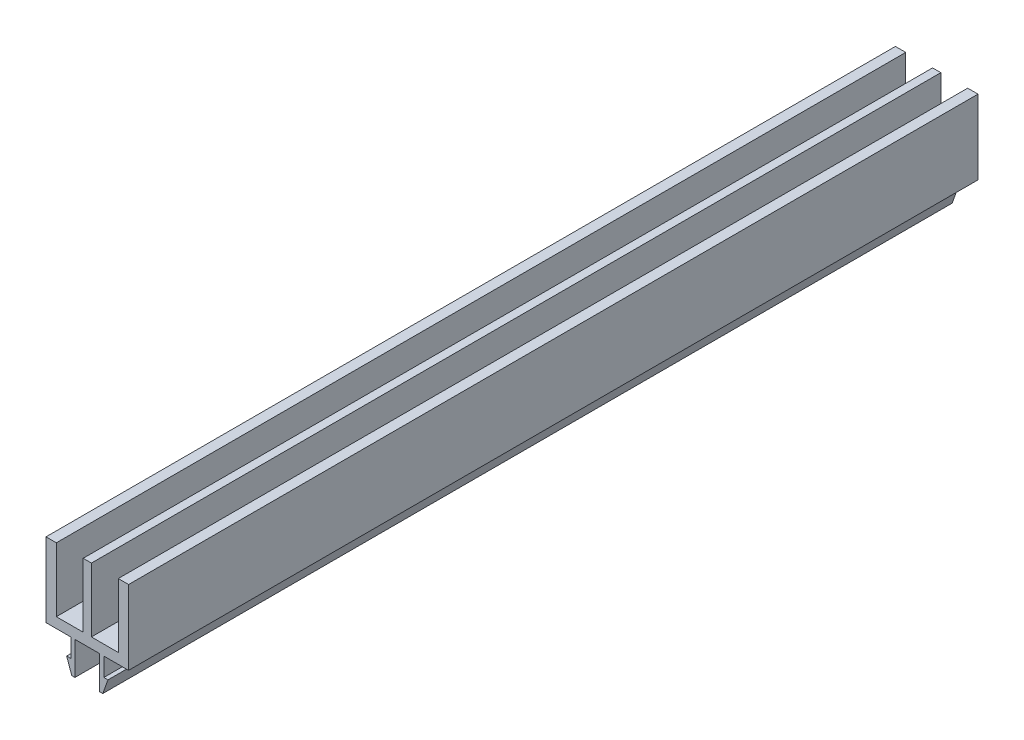
ISO-10303-21;
HEADER;
FILE_DESCRIPTION(('STEP AP214'),'2;1');
FILE_NAME('part.step','',(''),(''),'','','');
FILE_SCHEMA(('AUTOMOTIVE_DESIGN { 1 0 10303 214 1 1 1 1 }'));
ENDSEC;
DATA;
#1=APPLICATION_CONTEXT('core data for automotive mechanical design processes');
#2=APPLICATION_PROTOCOL_DEFINITION('international standard','automotive_design',2000,#1);
#3=PRODUCT_CONTEXT('',#1,'mechanical');
#4=PRODUCT('Part','Part','',(#3));
#5=PRODUCT_RELATED_PRODUCT_CATEGORY('part','',(#4));
#6=PRODUCT_DEFINITION_FORMATION('','',#4);
#7=PRODUCT_DEFINITION_CONTEXT('part definition',#1,'design');
#8=PRODUCT_DEFINITION('design','',#6,#7);
#9=PRODUCT_DEFINITION_SHAPE('','',#8);
#10=(LENGTH_UNIT() NAMED_UNIT(*) SI_UNIT(.MILLI.,.METRE.));
#11=(NAMED_UNIT(*) PLANE_ANGLE_UNIT() SI_UNIT($,.RADIAN.));
#12=(NAMED_UNIT(*) SI_UNIT($,.STERADIAN.) SOLID_ANGLE_UNIT());
#13=UNCERTAINTY_MEASURE_WITH_UNIT(LENGTH_MEASURE(1.E-05),#10,'distance_accuracy_value','');
#14=(GEOMETRIC_REPRESENTATION_CONTEXT(3) GLOBAL_UNCERTAINTY_ASSIGNED_CONTEXT((#13)) GLOBAL_UNIT_ASSIGNED_CONTEXT((#10,
#11,#12)) REPRESENTATION_CONTEXT('',''));
#15=CARTESIAN_POINT('',(0.,0.,0.));
#16=DIRECTION('',(0.,0.,1.));
#17=DIRECTION('',(1.,0.,0.));
#18=AXIS2_PLACEMENT_3D('',#15,#16,#17);
#19=CARTESIAN_POINT('',(-1.,17.9999999975,-155.71));
#20=DIRECTION('',(-1.,0.,0.));
#21=DIRECTION('',(0.,-1.,0.));
#22=AXIS2_PLACEMENT_3D('',#19,#20,#21);
#23=PLANE('',#22);
#24=DIRECTION('',(0.,-1.,0.));
#25=VECTOR('',#24,1.);
#26=CARTESIAN_POINT('',(-1.,17.9999999975,50.));
#27=LINE('',#26,#25);
#28=CARTESIAN_POINT('',(-1.,17.9999999975,50.));
#29=VERTEX_POINT('',#28);
#30=CARTESIAN_POINT('',(-1.,2.4999999995,50.));
#31=VERTEX_POINT('',#30);
#32=EDGE_CURVE('E225',#29,#31,#27,.T.);
#33=ORIENTED_EDGE('',*,*,#32,.F.);
#34=DIRECTION('',(0.,0.,1.));
#35=VECTOR('',#34,1.);
#36=CARTESIAN_POINT('',(-1.,17.9999999975,-155.71));
#37=LINE('',#36,#35);
#38=CARTESIAN_POINT('',(-1.,17.9999999975,-155.71));
#39=VERTEX_POINT('',#38);
#40=EDGE_CURVE('E11',#39,#29,#37,.T.);
#41=ORIENTED_EDGE('',*,*,#40,.F.);
#42=DIRECTION('',(0.,-1.,0.));
#43=VECTOR('',#42,1.);
#44=CARTESIAN_POINT('',(-1.,17.9999999975,-155.71));
#45=LINE('',#44,#43);
#46=CARTESIAN_POINT('',(-1.,2.4999999995,-155.71));
#47=VERTEX_POINT('',#46);
#48=EDGE_CURVE('E293',#39,#47,#45,.T.);
#49=ORIENTED_EDGE('',*,*,#48,.T.);
#50=DIRECTION('',(0.,0.,1.));
#51=VECTOR('',#50,1.);
#52=CARTESIAN_POINT('',(-1.,2.4999999995,-155.71));
#53=LINE('',#52,#51);
#54=EDGE_CURVE('E35',#47,#31,#53,.T.);
#55=ORIENTED_EDGE('',*,*,#54,.T.);
#56=EDGE_LOOP('',(#33,#41,#49,#55));
#57=FACE_BOUND('',#56,.T.);
#58=ADVANCED_FACE('F32',(#57),#23,.T.);
#59=CARTESIAN_POINT('',(0.999999999999998,17.9999999975,-155.71));
#60=DIRECTION('',(0.,1.,0.));
#61=DIRECTION('',(0.,0.,1.));
#62=AXIS2_PLACEMENT_3D('',#59,#60,#61);
#63=PLANE('',#62);
#64=DIRECTION('',(-1.,0.,0.));
#65=VECTOR('',#64,1.);
#66=CARTESIAN_POINT('',(0.999999999999998,17.9999999975,50.));
#67=LINE('',#66,#65);
#68=CARTESIAN_POINT('',(0.999999999999998,17.9999999975,50.));
#69=VERTEX_POINT('',#68);
#70=EDGE_CURVE('E291',#69,#29,#67,.T.);
#71=ORIENTED_EDGE('',*,*,#70,.F.);
#72=DIRECTION('',(0.,0.,1.));
#73=VECTOR('',#72,1.);
#74=CARTESIAN_POINT('',(0.999999999999998,17.9999999975,-155.71));
#75=LINE('',#74,#73);
#76=CARTESIAN_POINT('',(0.999999999999998,17.9999999975,-155.71));
#77=VERTEX_POINT('',#76);
#78=EDGE_CURVE('E41',#77,#69,#75,.T.);
#79=ORIENTED_EDGE('',*,*,#78,.F.);
#80=DIRECTION('',(-1.,0.,0.));
#81=VECTOR('',#80,1.);
#82=CARTESIAN_POINT('',(0.999999999999998,17.9999999975,-155.71));
#83=LINE('',#82,#81);
#84=EDGE_CURVE('E215',#77,#39,#83,.T.);
#85=ORIENTED_EDGE('',*,*,#84,.T.);
#86=ORIENTED_EDGE('',*,*,#40,.T.);
#87=EDGE_LOOP('',(#71,#79,#85,#86));
#88=FACE_BOUND('',#87,.T.);
#89=ADVANCED_FACE('F337',(#88),#63,.T.);
#90=CARTESIAN_POINT('',(0.999999999999998,2.4999999995,-155.71));
#91=DIRECTION('',(1.,0.,0.));
#92=DIRECTION('',(0.,0.,-1.));
#93=AXIS2_PLACEMENT_3D('',#90,#91,#92);
#94=PLANE('',#93);
#95=DIRECTION('',(0.,1.,0.));
#96=VECTOR('',#95,1.);
#97=CARTESIAN_POINT('',(0.999999999999998,2.4999999995,50.));
#98=LINE('',#97,#96);
#99=CARTESIAN_POINT('',(0.999999999999998,2.4999999995,50.));
#100=VERTEX_POINT('',#99);
#101=EDGE_CURVE('E202',#100,#69,#98,.T.);
#102=ORIENTED_EDGE('',*,*,#101,.F.);
#103=DIRECTION('',(0.,0.,1.));
#104=VECTOR('',#103,1.);
#105=CARTESIAN_POINT('',(0.999999999999998,2.4999999995,-155.71));
#106=LINE('',#105,#104);
#107=CARTESIAN_POINT('',(0.999999999999998,2.4999999995,-155.71));
#108=VERTEX_POINT('',#107);
#109=EDGE_CURVE('E197',#108,#100,#106,.T.);
#110=ORIENTED_EDGE('',*,*,#109,.F.);
#111=DIRECTION('',(0.,1.,0.));
#112=VECTOR('',#111,1.);
#113=CARTESIAN_POINT('',(0.999999999999998,2.4999999995,-155.71));
#114=LINE('',#113,#112);
#115=EDGE_CURVE('E200',#108,#77,#114,.T.);
#116=ORIENTED_EDGE('',*,*,#115,.T.);
#117=ORIENTED_EDGE('',*,*,#78,.T.);
#118=EDGE_LOOP('',(#102,#110,#116,#117));
#119=FACE_BOUND('',#118,.T.);
#120=ADVANCED_FACE('F199',(#119),#94,.T.);
#121=CARTESIAN_POINT('',(7.5,2.4999999995,-155.71));
#122=DIRECTION('',(0.,1.,0.));
#123=DIRECTION('',(-1.,0.,0.));
#124=AXIS2_PLACEMENT_3D('',#121,#122,#123);
#125=PLANE('',#124);
#126=DIRECTION('',(-1.,0.,0.));
#127=VECTOR('',#126,1.);
#128=CARTESIAN_POINT('',(7.5,2.4999999995,50.));
#129=LINE('',#128,#127);
#130=CARTESIAN_POINT('',(7.5,2.4999999995,50.));
#131=VERTEX_POINT('',#130);
#132=EDGE_CURVE('E288',#131,#100,#129,.T.);
#133=ORIENTED_EDGE('',*,*,#132,.F.);
#134=DIRECTION('',(0.,0.,1.));
#135=VECTOR('',#134,1.);
#136=CARTESIAN_POINT('',(7.5,2.4999999995,-155.71));
#137=LINE('',#136,#135);
#138=CARTESIAN_POINT('',(7.5,2.4999999995,-155.71));
#139=VERTEX_POINT('',#138);
#140=EDGE_CURVE('E207',#139,#131,#137,.T.);
#141=ORIENTED_EDGE('',*,*,#140,.F.);
#142=DIRECTION('',(-1.,0.,0.));
#143=VECTOR('',#142,1.);
#144=CARTESIAN_POINT('',(7.5,2.4999999995,-155.71));
#145=LINE('',#144,#143);
#146=EDGE_CURVE('E213',#139,#108,#145,.T.);
#147=ORIENTED_EDGE('',*,*,#146,.T.);
#148=ORIENTED_EDGE('',*,*,#109,.T.);
#149=EDGE_LOOP('',(#133,#141,#147,#148));
#150=FACE_BOUND('',#149,.T.);
#151=ADVANCED_FACE('F217',(#150),#125,.T.);
#152=CARTESIAN_POINT('',(7.5,17.9999999975,-155.71));
#153=DIRECTION('',(-1.,0.,0.));
#154=DIRECTION('',(0.,-1.,0.));
#155=AXIS2_PLACEMENT_3D('',#152,#153,#154);
#156=PLANE('',#155);
#157=DIRECTION('',(0.,-1.,0.));
#158=VECTOR('',#157,1.);
#159=CARTESIAN_POINT('',(7.5,17.9999999975,50.));
#160=LINE('',#159,#158);
#161=CARTESIAN_POINT('',(7.5,17.9999999975,50.));
#162=VERTEX_POINT('',#161);
#163=EDGE_CURVE('E285',#162,#131,#160,.T.);
#164=ORIENTED_EDGE('',*,*,#163,.F.);
#165=DIRECTION('',(0.,0.,1.));
#166=VECTOR('',#165,1.);
#167=CARTESIAN_POINT('',(7.5,17.9999999975,-155.71));
#168=LINE('',#167,#166);
#169=CARTESIAN_POINT('',(7.5,17.9999999975,-155.71));
#170=VERTEX_POINT('',#169);
#171=EDGE_CURVE('E297',#170,#162,#168,.T.);
#172=ORIENTED_EDGE('',*,*,#171,.F.);
#173=DIRECTION('',(0.,-1.,0.));
#174=VECTOR('',#173,1.);
#175=CARTESIAN_POINT('',(7.5,17.9999999975,-155.71));
#176=LINE('',#175,#174);
#177=EDGE_CURVE('E218',#170,#139,#176,.T.);
#178=ORIENTED_EDGE('',*,*,#177,.T.);
#179=ORIENTED_EDGE('',*,*,#140,.T.);
#180=EDGE_LOOP('',(#164,#172,#178,#179));
#181=FACE_BOUND('',#180,.T.);
#182=ADVANCED_FACE('F350',(#181),#156,.T.);
#183=CARTESIAN_POINT('',(10.,17.9999999975,-155.71));
#184=DIRECTION('',(0.,1.,0.));
#185=DIRECTION('',(0.,0.,1.));
#186=AXIS2_PLACEMENT_3D('',#183,#184,#185);
#187=PLANE('',#186);
#188=DIRECTION('',(-1.,0.,0.));
#189=VECTOR('',#188,1.);
#190=CARTESIAN_POINT('',(10.,17.9999999975,50.));
#191=LINE('',#190,#189);
#192=CARTESIAN_POINT('',(10.,17.9999999975,50.));
#193=VERTEX_POINT('',#192);
#194=EDGE_CURVE('E282',#193,#162,#191,.T.);
#195=ORIENTED_EDGE('',*,*,#194,.F.);
#196=DIRECTION('',(0.,0.,1.));
#197=VECTOR('',#196,1.);
#198=CARTESIAN_POINT('',(10.,17.9999999975,-155.71));
#199=LINE('',#198,#197);
#200=CARTESIAN_POINT('',(10.,17.9999999975,-155.71));
#201=VERTEX_POINT('',#200);
#202=EDGE_CURVE('E299',#201,#193,#199,.T.);
#203=ORIENTED_EDGE('',*,*,#202,.F.);
#204=DIRECTION('',(-1.,0.,0.));
#205=VECTOR('',#204,1.);
#206=CARTESIAN_POINT('',(10.,17.9999999975,-155.71));
#207=LINE('',#206,#205);
#208=EDGE_CURVE('E220',#201,#170,#207,.T.);
#209=ORIENTED_EDGE('',*,*,#208,.T.);
#210=ORIENTED_EDGE('',*,*,#171,.T.);
#211=EDGE_LOOP('',(#195,#203,#209,#210));
#212=FACE_BOUND('',#211,.T.);
#213=ADVANCED_FACE('F353',(#212),#187,.T.);
#214=CARTESIAN_POINT('',(10.,-4.99999828349541E-10,-155.71));
#215=DIRECTION('',(1.,0.,0.));
#216=DIRECTION('',(0.,0.,-1.));
#217=AXIS2_PLACEMENT_3D('',#214,#215,#216);
#218=PLANE('',#217);
#219=DIRECTION('',(0.,1.,0.));
#220=VECTOR('',#219,1.);
#221=CARTESIAN_POINT('',(10.,-4.99999828349541E-10,50.));
#222=LINE('',#221,#220);
#223=CARTESIAN_POINT('',(10.,-4.99999828349541E-10,50.));
#224=VERTEX_POINT('',#223);
#225=EDGE_CURVE('E279',#224,#193,#222,.T.);
#226=ORIENTED_EDGE('',*,*,#225,.F.);
#227=DIRECTION('',(0.,0.,1.));
#228=VECTOR('',#227,1.);
#229=CARTESIAN_POINT('',(10.,-4.99999828349541E-10,-155.71));
#230=LINE('',#229,#228);
#231=CARTESIAN_POINT('',(10.,-4.99999828349541E-10,-155.71));
#232=VERTEX_POINT('',#231);
#233=EDGE_CURVE('E301',#232,#224,#230,.T.);
#234=ORIENTED_EDGE('',*,*,#233,.F.);
#235=DIRECTION('',(0.,1.,0.));
#236=VECTOR('',#235,1.);
#237=CARTESIAN_POINT('',(10.,-4.99999828349541E-10,-155.71));
#238=LINE('',#237,#236);
#239=EDGE_CURVE('E643',#232,#201,#238,.T.);
#240=ORIENTED_EDGE('',*,*,#239,.T.);
#241=ORIENTED_EDGE('',*,*,#202,.T.);
#242=EDGE_LOOP('',(#226,#234,#240,#241));
#243=FACE_BOUND('',#242,.T.);
#244=ADVANCED_FACE('F357',(#243),#218,.T.);
#245=CARTESIAN_POINT('',(4.,-4.99999998002099E-10,-155.71));
#246=DIRECTION('',(0.,-1.,0.));
#247=DIRECTION('',(1.,0.,0.));
#248=AXIS2_PLACEMENT_3D('',#245,#246,#247);
#249=PLANE('',#248);
#250=DIRECTION('',(1.,0.,0.));
#251=VECTOR('',#250,1.);
#252=CARTESIAN_POINT('',(4.,-4.99999998002099E-10,50.));
#253=LINE('',#252,#251);
#254=CARTESIAN_POINT('',(4.,-4.99999998002099E-10,50.));
#255=VERTEX_POINT('',#254);
#256=EDGE_CURVE('E276',#255,#224,#253,.T.);
#257=ORIENTED_EDGE('',*,*,#256,.F.);
#258=DIRECTION('',(0.,0.,1.));
#259=VECTOR('',#258,1.);
#260=CARTESIAN_POINT('',(4.,-4.99999998002099E-10,-155.71));
#261=LINE('',#260,#259);
#262=CARTESIAN_POINT('',(4.,-4.99999998002099E-10,-155.71));
#263=VERTEX_POINT('',#262);
#264=EDGE_CURVE('E303',#263,#255,#261,.T.);
#265=ORIENTED_EDGE('',*,*,#264,.F.);
#266=DIRECTION('',(1.,0.,0.));
#267=VECTOR('',#266,1.);
#268=CARTESIAN_POINT('',(4.,-4.99999998002099E-10,-155.71));
#269=LINE('',#268,#267);
#270=EDGE_CURVE('E647',#263,#232,#269,.T.);
#271=ORIENTED_EDGE('',*,*,#270,.T.);
#272=ORIENTED_EDGE('',*,*,#233,.T.);
#273=EDGE_LOOP('',(#257,#265,#271,#272));
#274=FACE_BOUND('',#273,.T.);
#275=ADVANCED_FACE('F361',(#274),#249,.T.);
#276=CARTESIAN_POINT('',(4.,-4.5,-155.71));
#277=DIRECTION('',(1.,0.,0.));
#278=DIRECTION('',(0.,0.,-1.));
#279=AXIS2_PLACEMENT_3D('',#276,#277,#278);
#280=PLANE('',#279);
#281=DIRECTION('',(0.,1.,0.));
#282=VECTOR('',#281,1.);
#283=CARTESIAN_POINT('',(4.,-4.5,50.));
#284=LINE('',#283,#282);
#285=CARTESIAN_POINT('',(4.,-4.5,50.));
#286=VERTEX_POINT('',#285);
#287=EDGE_CURVE('E273',#286,#255,#284,.T.);
#288=ORIENTED_EDGE('',*,*,#287,.F.);
#289=DIRECTION('',(0.,0.,1.));
#290=VECTOR('',#289,1.);
#291=CARTESIAN_POINT('',(4.,-4.5,-155.71));
#292=LINE('',#291,#290);
#293=CARTESIAN_POINT('',(4.,-4.5,-155.71));
#294=VERTEX_POINT('',#293);
#295=EDGE_CURVE('E305',#294,#286,#292,.T.);
#296=ORIENTED_EDGE('',*,*,#295,.F.);
#297=DIRECTION('',(0.,1.,0.));
#298=VECTOR('',#297,1.);
#299=CARTESIAN_POINT('',(4.,-4.5,-155.71));
#300=LINE('',#299,#298);
#301=EDGE_CURVE('E636',#294,#263,#300,.T.);
#302=ORIENTED_EDGE('',*,*,#301,.T.);
#303=ORIENTED_EDGE('',*,*,#264,.T.);
#304=EDGE_LOOP('',(#288,#296,#302,#303));
#305=FACE_BOUND('',#304,.T.);
#306=ADVANCED_FACE('F365',(#305),#280,.T.);
#307=CARTESIAN_POINT('',(5.,-4.5,-155.71));
#308=DIRECTION('',(0.,1.,0.));
#309=DIRECTION('',(0.,0.,1.));
#310=AXIS2_PLACEMENT_3D('',#307,#308,#309);
#311=PLANE('',#310);
#312=DIRECTION('',(-1.,0.,0.));
#313=VECTOR('',#312,1.);
#314=CARTESIAN_POINT('',(5.,-4.5,50.));
#315=LINE('',#314,#313);
#316=CARTESIAN_POINT('',(5.,-4.5,50.));
#317=VERTEX_POINT('',#316);
#318=EDGE_CURVE('E270',#317,#286,#315,.T.);
#319=ORIENTED_EDGE('',*,*,#318,.F.);
#320=DIRECTION('',(0.,0.,1.));
#321=VECTOR('',#320,1.);
#322=CARTESIAN_POINT('',(5.,-4.5,-155.71));
#323=LINE('',#322,#321);
#324=CARTESIAN_POINT('',(5.,-4.5,-155.71));
#325=VERTEX_POINT('',#324);
#326=EDGE_CURVE('E307',#325,#317,#323,.T.);
#327=ORIENTED_EDGE('',*,*,#326,.F.);
#328=DIRECTION('',(-1.,0.,0.));
#329=VECTOR('',#328,1.);
#330=CARTESIAN_POINT('',(5.,-4.5,-155.71));
#331=LINE('',#330,#329);
#332=EDGE_CURVE('E632',#325,#294,#331,.T.);
#333=ORIENTED_EDGE('',*,*,#332,.T.);
#334=ORIENTED_EDGE('',*,*,#295,.T.);
#335=EDGE_LOOP('',(#319,#327,#333,#334));
#336=FACE_BOUND('',#335,.T.);
#337=ADVANCED_FACE('F369',(#336),#311,.T.);
#338=CARTESIAN_POINT('',(3.75,-8.,-155.71));
#339=DIRECTION('',(0.941741911594837,-0.336336396998157,0.));
#340=DIRECTION('',(0.336336396998157,0.941741911594837,0.));
#341=AXIS2_PLACEMENT_3D('',#338,#339,#340);
#342=PLANE('',#341);
#343=DIRECTION('',(0.336336396998157,0.941741911594837,0.));
#344=VECTOR('',#343,1.);
#345=CARTESIAN_POINT('',(3.75,-8.,50.));
#346=LINE('',#345,#344);
#347=CARTESIAN_POINT('',(3.75,-8.,50.));
#348=VERTEX_POINT('',#347);
#349=EDGE_CURVE('E267',#348,#317,#346,.T.);
#350=ORIENTED_EDGE('',*,*,#349,.F.);
#351=DIRECTION('',(0.,0.,1.));
#352=VECTOR('',#351,1.);
#353=CARTESIAN_POINT('',(3.75,-8.,-155.71));
#354=LINE('',#353,#352);
#355=CARTESIAN_POINT('',(3.75,-8.,-155.71));
#356=VERTEX_POINT('',#355);
#357=EDGE_CURVE('E309',#356,#348,#354,.T.);
#358=ORIENTED_EDGE('',*,*,#357,.F.);
#359=DIRECTION('',(0.336336396998157,0.941741911594837,0.));
#360=VECTOR('',#359,1.);
#361=CARTESIAN_POINT('',(3.75,-8.,-155.71));
#362=LINE('',#361,#360);
#363=EDGE_CURVE('E653',#356,#325,#362,.T.);
#364=ORIENTED_EDGE('',*,*,#363,.T.);
#365=ORIENTED_EDGE('',*,*,#326,.T.);
#366=EDGE_LOOP('',(#350,#358,#364,#365));
#367=FACE_BOUND('',#366,.T.);
#368=ADVANCED_FACE('F373',(#367),#342,.T.);
#369=CARTESIAN_POINT('',(3.,-8.,-155.71));
#370=DIRECTION('',(0.,-1.,0.));
#371=DIRECTION('',(0.,0.,-1.));
#372=AXIS2_PLACEMENT_3D('',#369,#370,#371);
#373=PLANE('',#372);
#374=DIRECTION('',(1.,0.,0.));
#375=VECTOR('',#374,1.);
#376=CARTESIAN_POINT('',(3.,-8.,50.));
#377=LINE('',#376,#375);
#378=CARTESIAN_POINT('',(3.,-8.,50.));
#379=VERTEX_POINT('',#378);
#380=EDGE_CURVE('E264',#379,#348,#377,.T.);
#381=ORIENTED_EDGE('',*,*,#380,.F.);
#382=DIRECTION('',(0.,0.,1.));
#383=VECTOR('',#382,1.);
#384=CARTESIAN_POINT('',(3.,-8.,-155.71));
#385=LINE('',#384,#383);
#386=CARTESIAN_POINT('',(3.,-8.,-155.71));
#387=VERTEX_POINT('',#386);
#388=EDGE_CURVE('E311',#387,#379,#385,.T.);
#389=ORIENTED_EDGE('',*,*,#388,.F.);
#390=DIRECTION('',(1.,0.,0.));
#391=VECTOR('',#390,1.);
#392=CARTESIAN_POINT('',(3.,-8.,-155.71));
#393=LINE('',#392,#391);
#394=EDGE_CURVE('E625',#387,#356,#393,.T.);
#395=ORIENTED_EDGE('',*,*,#394,.T.);
#396=ORIENTED_EDGE('',*,*,#357,.T.);
#397=EDGE_LOOP('',(#381,#389,#395,#396));
#398=FACE_BOUND('',#397,.T.);
#399=ADVANCED_FACE('F377',(#398),#373,.T.);
#400=CARTESIAN_POINT('',(3.,-4.9999985194348E-10,-155.71));
#401=DIRECTION('',(-1.,0.,0.));
#402=DIRECTION('',(0.,0.,1.));
#403=AXIS2_PLACEMENT_3D('',#400,#401,#402);
#404=PLANE('',#403);
#405=DIRECTION('',(0.,-1.,0.));
#406=VECTOR('',#405,1.);
#407=CARTESIAN_POINT('',(3.,-4.9999985194348E-10,50.));
#408=LINE('',#407,#406);
#409=CARTESIAN_POINT('',(3.,-4.9999985194348E-10,50.));
#410=VERTEX_POINT('',#409);
#411=EDGE_CURVE('E261',#410,#379,#408,.T.);
#412=ORIENTED_EDGE('',*,*,#411,.F.);
#413=DIRECTION('',(0.,0.,1.));
#414=VECTOR('',#413,1.);
#415=CARTESIAN_POINT('',(3.,-4.9999985194348E-10,-155.71));
#416=LINE('',#415,#414);
#417=CARTESIAN_POINT('',(3.,-4.9999985194348E-10,-155.71));
#418=VERTEX_POINT('',#417);
#419=EDGE_CURVE('E313',#418,#410,#416,.T.);
#420=ORIENTED_EDGE('',*,*,#419,.F.);
#421=DIRECTION('',(0.,-1.,0.));
#422=VECTOR('',#421,1.);
#423=CARTESIAN_POINT('',(3.,-4.9999985194348E-10,-155.71));
#424=LINE('',#423,#422);
#425=EDGE_CURVE('E621',#418,#387,#424,.T.);
#426=ORIENTED_EDGE('',*,*,#425,.T.);
#427=ORIENTED_EDGE('',*,*,#388,.T.);
#428=EDGE_LOOP('',(#412,#420,#426,#427));
#429=FACE_BOUND('',#428,.T.);
#430=ADVANCED_FACE('F381',(#429),#404,.T.);
#431=CARTESIAN_POINT('',(-3.,-4.99999455901012E-10,-155.71));
#432=DIRECTION('',(0.,-1.,0.));
#433=DIRECTION('',(1.,0.,0.));
#434=AXIS2_PLACEMENT_3D('',#431,#432,#433);
#435=PLANE('',#434);
#436=DIRECTION('',(1.,0.,0.));
#437=VECTOR('',#436,1.);
#438=CARTESIAN_POINT('',(-3.,-4.99999455901012E-10,50.));
#439=LINE('',#438,#437);
#440=CARTESIAN_POINT('',(-3.,-4.99999455901012E-10,50.));
#441=VERTEX_POINT('',#440);
#442=EDGE_CURVE('E258',#441,#410,#439,.T.);
#443=ORIENTED_EDGE('',*,*,#442,.F.);
#444=DIRECTION('',(0.,0.,1.));
#445=VECTOR('',#444,1.);
#446=CARTESIAN_POINT('',(-3.,-4.99999455901012E-10,-155.71));
#447=LINE('',#446,#445);
#448=CARTESIAN_POINT('',(-3.,-4.99999455901012E-10,-155.71));
#449=VERTEX_POINT('',#448);
#450=EDGE_CURVE('E315',#449,#441,#447,.T.);
#451=ORIENTED_EDGE('',*,*,#450,.F.);
#452=DIRECTION('',(1.,0.,0.));
#453=VECTOR('',#452,1.);
#454=CARTESIAN_POINT('',(-3.,-4.99999455901012E-10,-155.71));
#455=LINE('',#454,#453);
#456=EDGE_CURVE('E657',#449,#418,#455,.T.);
#457=ORIENTED_EDGE('',*,*,#456,.T.);
#458=ORIENTED_EDGE('',*,*,#419,.T.);
#459=EDGE_LOOP('',(#443,#451,#457,#458));
#460=FACE_BOUND('',#459,.T.);
#461=ADVANCED_FACE('F385',(#460),#435,.T.);
#462=CARTESIAN_POINT('',(-3.,-8.,-155.71));
#463=DIRECTION('',(1.,0.,0.));
#464=DIRECTION('',(0.,0.,-1.));
#465=AXIS2_PLACEMENT_3D('',#462,#463,#464);
#466=PLANE('',#465);
#467=DIRECTION('',(0.,1.,0.));
#468=VECTOR('',#467,1.);
#469=CARTESIAN_POINT('',(-3.,-8.,50.));
#470=LINE('',#469,#468);
#471=CARTESIAN_POINT('',(-3.,-8.,50.));
#472=VERTEX_POINT('',#471);
#473=EDGE_CURVE('E255',#472,#441,#470,.T.);
#474=ORIENTED_EDGE('',*,*,#473,.F.);
#475=DIRECTION('',(0.,0.,1.));
#476=VECTOR('',#475,1.);
#477=CARTESIAN_POINT('',(-3.,-8.,-155.71));
#478=LINE('',#477,#476);
#479=CARTESIAN_POINT('',(-3.,-8.,-155.71));
#480=VERTEX_POINT('',#479);
#481=EDGE_CURVE('E317',#480,#472,#478,.T.);
#482=ORIENTED_EDGE('',*,*,#481,.F.);
#483=DIRECTION('',(0.,1.,0.));
#484=VECTOR('',#483,1.);
#485=CARTESIAN_POINT('',(-3.,-8.,-155.71));
#486=LINE('',#485,#484);
#487=EDGE_CURVE('E614',#480,#449,#486,.T.);
#488=ORIENTED_EDGE('',*,*,#487,.T.);
#489=ORIENTED_EDGE('',*,*,#450,.T.);
#490=EDGE_LOOP('',(#474,#482,#488,#489));
#491=FACE_BOUND('',#490,.T.);
#492=ADVANCED_FACE('F389',(#491),#466,.T.);
#493=CARTESIAN_POINT('',(-3.75,-8.,-155.71));
#494=DIRECTION('',(0.,-1.,0.));
#495=DIRECTION('',(0.,0.,-1.));
#496=AXIS2_PLACEMENT_3D('',#493,#494,#495);
#497=PLANE('',#496);
#498=DIRECTION('',(1.,0.,0.));
#499=VECTOR('',#498,1.);
#500=CARTESIAN_POINT('',(-3.75,-8.,50.));
#501=LINE('',#500,#499);
#502=CARTESIAN_POINT('',(-3.75,-8.,50.));
#503=VERTEX_POINT('',#502);
#504=EDGE_CURVE('E252',#503,#472,#501,.T.);
#505=ORIENTED_EDGE('',*,*,#504,.F.);
#506=DIRECTION('',(0.,0.,1.));
#507=VECTOR('',#506,1.);
#508=CARTESIAN_POINT('',(-3.75,-8.,-155.71));
#509=LINE('',#508,#507);
#510=CARTESIAN_POINT('',(-3.75,-8.,-155.71));
#511=VERTEX_POINT('',#510);
#512=EDGE_CURVE('E319',#511,#503,#509,.T.);
#513=ORIENTED_EDGE('',*,*,#512,.F.);
#514=DIRECTION('',(1.,0.,0.));
#515=VECTOR('',#514,1.);
#516=CARTESIAN_POINT('',(-3.75,-8.,-155.71));
#517=LINE('',#516,#515);
#518=EDGE_CURVE('E610',#511,#480,#517,.T.);
#519=ORIENTED_EDGE('',*,*,#518,.T.);
#520=ORIENTED_EDGE('',*,*,#481,.T.);
#521=EDGE_LOOP('',(#505,#513,#519,#520));
#522=FACE_BOUND('',#521,.T.);
#523=ADVANCED_FACE('F393',(#522),#497,.T.);
#524=CARTESIAN_POINT('',(-5.,-4.5,-155.71));
#525=DIRECTION('',(-0.941741911594837,-0.336336396998156,0.));
#526=DIRECTION('',(0.336336396998156,-0.941741911594837,0.));
#527=AXIS2_PLACEMENT_3D('',#524,#525,#526);
#528=PLANE('',#527);
#529=DIRECTION('',(0.336336396998156,-0.941741911594837,0.));
#530=VECTOR('',#529,1.);
#531=CARTESIAN_POINT('',(-5.,-4.5,50.));
#532=LINE('',#531,#530);
#533=CARTESIAN_POINT('',(-5.,-4.5,50.));
#534=VERTEX_POINT('',#533);
#535=EDGE_CURVE('E249',#534,#503,#532,.T.);
#536=ORIENTED_EDGE('',*,*,#535,.F.);
#537=DIRECTION('',(0.,0.,1.));
#538=VECTOR('',#537,1.);
#539=CARTESIAN_POINT('',(-5.,-4.5,-155.71));
#540=LINE('',#539,#538);
#541=CARTESIAN_POINT('',(-5.,-4.5,-155.71));
#542=VERTEX_POINT('',#541);
#543=EDGE_CURVE('E321',#542,#534,#540,.T.);
#544=ORIENTED_EDGE('',*,*,#543,.F.);
#545=DIRECTION('',(0.336336396998156,-0.941741911594837,0.));
#546=VECTOR('',#545,1.);
#547=CARTESIAN_POINT('',(-5.,-4.5,-155.71));
#548=LINE('',#547,#546);
#549=EDGE_CURVE('E661',#542,#511,#548,.T.);
#550=ORIENTED_EDGE('',*,*,#549,.T.);
#551=ORIENTED_EDGE('',*,*,#512,.T.);
#552=EDGE_LOOP('',(#536,#544,#550,#551));
#553=FACE_BOUND('',#552,.T.);
#554=ADVANCED_FACE('F397',(#553),#528,.T.);
#555=CARTESIAN_POINT('',(-4.,-4.5,-155.71));
#556=DIRECTION('',(0.,1.,0.));
#557=DIRECTION('',(0.,0.,1.));
#558=AXIS2_PLACEMENT_3D('',#555,#556,#557);
#559=PLANE('',#558);
#560=DIRECTION('',(-1.,0.,0.));
#561=VECTOR('',#560,1.);
#562=CARTESIAN_POINT('',(-4.,-4.5,50.));
#563=LINE('',#562,#561);
#564=CARTESIAN_POINT('',(-4.,-4.5,50.));
#565=VERTEX_POINT('',#564);
#566=EDGE_CURVE('E246',#565,#534,#563,.T.);
#567=ORIENTED_EDGE('',*,*,#566,.F.);
#568=DIRECTION('',(0.,0.,1.));
#569=VECTOR('',#568,1.);
#570=CARTESIAN_POINT('',(-4.,-4.5,-155.71));
#571=LINE('',#570,#569);
#572=CARTESIAN_POINT('',(-4.,-4.5,-155.71));
#573=VERTEX_POINT('',#572);
#574=EDGE_CURVE('E323',#573,#565,#571,.T.);
#575=ORIENTED_EDGE('',*,*,#574,.F.);
#576=DIRECTION('',(-1.,0.,0.));
#577=VECTOR('',#576,1.);
#578=CARTESIAN_POINT('',(-4.,-4.5,-155.71));
#579=LINE('',#578,#577);
#580=EDGE_CURVE('E603',#573,#542,#579,.T.);
#581=ORIENTED_EDGE('',*,*,#580,.T.);
#582=ORIENTED_EDGE('',*,*,#543,.T.);
#583=EDGE_LOOP('',(#567,#575,#581,#582));
#584=FACE_BOUND('',#583,.T.);
#585=ADVANCED_FACE('F401',(#584),#559,.T.);
#586=CARTESIAN_POINT('',(-4.,-4.9999985194348E-10,-155.71));
#587=DIRECTION('',(-1.,0.,0.));
#588=DIRECTION('',(0.,0.,1.));
#589=AXIS2_PLACEMENT_3D('',#586,#587,#588);
#590=PLANE('',#589);
#591=DIRECTION('',(0.,-1.,0.));
#592=VECTOR('',#591,1.);
#593=CARTESIAN_POINT('',(-4.,-4.9999985194348E-10,50.));
#594=LINE('',#593,#592);
#595=CARTESIAN_POINT('',(-4.,-4.9999985194348E-10,50.));
#596=VERTEX_POINT('',#595);
#597=EDGE_CURVE('E243',#596,#565,#594,.T.);
#598=ORIENTED_EDGE('',*,*,#597,.F.);
#599=DIRECTION('',(0.,0.,1.));
#600=VECTOR('',#599,1.);
#601=CARTESIAN_POINT('',(-4.,-4.9999985194348E-10,-155.71));
#602=LINE('',#601,#600);
#603=CARTESIAN_POINT('',(-4.,-4.9999985194348E-10,-155.71));
#604=VERTEX_POINT('',#603);
#605=EDGE_CURVE('E325',#604,#596,#602,.T.);
#606=ORIENTED_EDGE('',*,*,#605,.F.);
#607=DIRECTION('',(0.,-1.,0.));
#608=VECTOR('',#607,1.);
#609=CARTESIAN_POINT('',(-4.,-4.9999985194348E-10,-155.71));
#610=LINE('',#609,#608);
#611=EDGE_CURVE('E599',#604,#573,#610,.T.);
#612=ORIENTED_EDGE('',*,*,#611,.T.);
#613=ORIENTED_EDGE('',*,*,#574,.T.);
#614=EDGE_LOOP('',(#598,#606,#612,#613));
#615=FACE_BOUND('',#614,.T.);
#616=ADVANCED_FACE('F405',(#615),#590,.T.);
#617=CARTESIAN_POINT('',(-10.,-4.99999719929324E-10,-155.71));
#618=DIRECTION('',(0.,-1.,0.));
#619=DIRECTION('',(1.,0.,0.));
#620=AXIS2_PLACEMENT_3D('',#617,#618,#619);
#621=PLANE('',#620);
#622=DIRECTION('',(1.,0.,0.));
#623=VECTOR('',#622,1.);
#624=CARTESIAN_POINT('',(-10.,-4.99999719929324E-10,50.));
#625=LINE('',#624,#623);
#626=CARTESIAN_POINT('',(-10.,-4.99999719929324E-10,50.));
#627=VERTEX_POINT('',#626);
#628=EDGE_CURVE('E240',#627,#596,#625,.T.);
#629=ORIENTED_EDGE('',*,*,#628,.F.);
#630=DIRECTION('',(0.,0.,1.));
#631=VECTOR('',#630,1.);
#632=CARTESIAN_POINT('',(-10.,-4.99999719929324E-10,-155.71));
#633=LINE('',#632,#631);
#634=CARTESIAN_POINT('',(-10.,-4.99999719929324E-10,-155.71));
#635=VERTEX_POINT('',#634);
#636=EDGE_CURVE('E327',#635,#627,#633,.T.);
#637=ORIENTED_EDGE('',*,*,#636,.F.);
#638=DIRECTION('',(1.,0.,0.));
#639=VECTOR('',#638,1.);
#640=CARTESIAN_POINT('',(-10.,-4.99999719929324E-10,-155.71));
#641=LINE('',#640,#639);
#642=EDGE_CURVE('E665',#635,#604,#641,.T.);
#643=ORIENTED_EDGE('',*,*,#642,.T.);
#644=ORIENTED_EDGE('',*,*,#605,.T.);
#645=EDGE_LOOP('',(#629,#637,#643,#644));
#646=FACE_BOUND('',#645,.T.);
#647=ADVANCED_FACE('F409',(#646),#621,.T.);
#648=CARTESIAN_POINT('',(-10.,17.9999999975,-155.71));
#649=DIRECTION('',(-1.,0.,0.));
#650=DIRECTION('',(0.,-1.,0.));
#651=AXIS2_PLACEMENT_3D('',#648,#649,#650);
#652=PLANE('',#651);
#653=DIRECTION('',(0.,-1.,0.));
#654=VECTOR('',#653,1.);
#655=CARTESIAN_POINT('',(-10.,17.9999999975,50.));
#656=LINE('',#655,#654);
#657=CARTESIAN_POINT('',(-10.,17.9999999975,50.));
#658=VERTEX_POINT('',#657);
#659=EDGE_CURVE('E237',#658,#627,#656,.T.);
#660=ORIENTED_EDGE('',*,*,#659,.F.);
#661=DIRECTION('',(0.,0.,1.));
#662=VECTOR('',#661,1.);
#663=CARTESIAN_POINT('',(-10.,17.9999999975,-155.71));
#664=LINE('',#663,#662);
#665=CARTESIAN_POINT('',(-10.,17.9999999975,-155.71));
#666=VERTEX_POINT('',#665);
#667=EDGE_CURVE('E329',#666,#658,#664,.T.);
#668=ORIENTED_EDGE('',*,*,#667,.F.);
#669=DIRECTION('',(0.,-1.,0.));
#670=VECTOR('',#669,1.);
#671=CARTESIAN_POINT('',(-10.,17.9999999975,-155.71));
#672=LINE('',#671,#670);
#673=EDGE_CURVE('E592',#666,#635,#672,.T.);
#674=ORIENTED_EDGE('',*,*,#673,.T.);
#675=ORIENTED_EDGE('',*,*,#636,.T.);
#676=EDGE_LOOP('',(#660,#668,#674,#675));
#677=FACE_BOUND('',#676,.T.);
#678=ADVANCED_FACE('F413',(#677),#652,.T.);
#679=CARTESIAN_POINT('',(-7.5,17.9999999975,-155.71));
#680=DIRECTION('',(0.,1.,0.));
#681=DIRECTION('',(0.,0.,1.));
#682=AXIS2_PLACEMENT_3D('',#679,#680,#681);
#683=PLANE('',#682);
#684=DIRECTION('',(-1.,0.,0.));
#685=VECTOR('',#684,1.);
#686=CARTESIAN_POINT('',(-7.5,17.9999999975,50.));
#687=LINE('',#686,#685);
#688=CARTESIAN_POINT('',(-7.5,17.9999999975,50.));
#689=VERTEX_POINT('',#688);
#690=EDGE_CURVE('E234',#689,#658,#687,.T.);
#691=ORIENTED_EDGE('',*,*,#690,.F.);
#692=DIRECTION('',(0.,0.,1.));
#693=VECTOR('',#692,1.);
#694=CARTESIAN_POINT('',(-7.5,17.9999999975,-155.71));
#695=LINE('',#694,#693);
#696=CARTESIAN_POINT('',(-7.5,17.9999999975,-155.71));
#697=VERTEX_POINT('',#696);
#698=EDGE_CURVE('E331',#697,#689,#695,.T.);
#699=ORIENTED_EDGE('',*,*,#698,.F.);
#700=DIRECTION('',(-1.,0.,0.));
#701=VECTOR('',#700,1.);
#702=CARTESIAN_POINT('',(-7.5,17.9999999975,-155.71));
#703=LINE('',#702,#701);
#704=EDGE_CURVE('E588',#697,#666,#703,.T.);
#705=ORIENTED_EDGE('',*,*,#704,.T.);
#706=ORIENTED_EDGE('',*,*,#667,.T.);
#707=EDGE_LOOP('',(#691,#699,#705,#706));
#708=FACE_BOUND('',#707,.T.);
#709=ADVANCED_FACE('F417',(#708),#683,.T.);
#710=CARTESIAN_POINT('',(-7.5,2.4999999995,-155.71));
#711=DIRECTION('',(1.,0.,0.));
#712=DIRECTION('',(0.,0.,-1.));
#713=AXIS2_PLACEMENT_3D('',#710,#711,#712);
#714=PLANE('',#713);
#715=DIRECTION('',(0.,1.,0.));
#716=VECTOR('',#715,1.);
#717=CARTESIAN_POINT('',(-7.5,2.4999999995,50.));
#718=LINE('',#717,#716);
#719=CARTESIAN_POINT('',(-7.5,2.4999999995,50.));
#720=VERTEX_POINT('',#719);
#721=EDGE_CURVE('E231',#720,#689,#718,.T.);
#722=ORIENTED_EDGE('',*,*,#721,.F.);
#723=DIRECTION('',(0.,0.,1.));
#724=VECTOR('',#723,1.);
#725=CARTESIAN_POINT('',(-7.5,2.4999999995,-155.71));
#726=LINE('',#725,#724);
#727=CARTESIAN_POINT('',(-7.5,2.4999999995,-155.71));
#728=VERTEX_POINT('',#727);
#729=EDGE_CURVE('E332',#728,#720,#726,.T.);
#730=ORIENTED_EDGE('',*,*,#729,.F.);
#731=DIRECTION('',(0.,1.,0.));
#732=VECTOR('',#731,1.);
#733=CARTESIAN_POINT('',(-7.5,2.4999999995,-155.71));
#734=LINE('',#733,#732);
#735=EDGE_CURVE('E669',#728,#697,#734,.T.);
#736=ORIENTED_EDGE('',*,*,#735,.T.);
#737=ORIENTED_EDGE('',*,*,#698,.T.);
#738=EDGE_LOOP('',(#722,#730,#736,#737));
#739=FACE_BOUND('',#738,.T.);
#740=ADVANCED_FACE('F421',(#739),#714,.T.);
#741=CARTESIAN_POINT('',(-1.,2.4999999995,-155.71));
#742=DIRECTION('',(0.,1.,0.));
#743=DIRECTION('',(-1.,0.,0.));
#744=AXIS2_PLACEMENT_3D('',#741,#742,#743);
#745=PLANE('',#744);
#746=DIRECTION('',(-1.,0.,0.));
#747=VECTOR('',#746,1.);
#748=CARTESIAN_POINT('',(-1.,2.4999999995,50.));
#749=LINE('',#748,#747);
#750=EDGE_CURVE('E228',#31,#720,#749,.T.);
#751=ORIENTED_EDGE('',*,*,#750,.F.);
#752=ORIENTED_EDGE('',*,*,#54,.F.);
#753=DIRECTION('',(-1.,0.,0.));
#754=VECTOR('',#753,1.);
#755=CARTESIAN_POINT('',(-1.,2.4999999995,-155.71));
#756=LINE('',#755,#754);
#757=EDGE_CURVE('E671',#47,#728,#756,.T.);
#758=ORIENTED_EDGE('',*,*,#757,.T.);
#759=ORIENTED_EDGE('',*,*,#729,.T.);
#760=EDGE_LOOP('',(#751,#752,#758,#759));
#761=FACE_BOUND('',#760,.T.);
#762=ADVANCED_FACE('F334',(#761),#745,.T.);
#763=CARTESIAN_POINT('',(0.,0.,-155.71));
#764=DIRECTION('',(0.,0.,-1.));
#765=DIRECTION('',(-1.,0.,0.));
#766=AXIS2_PLACEMENT_3D('',#763,#764,#765);
#767=PLANE('',#766);
#768=ORIENTED_EDGE('',*,*,#48,.F.);
#769=ORIENTED_EDGE('',*,*,#84,.F.);
#770=ORIENTED_EDGE('',*,*,#115,.F.);
#771=ORIENTED_EDGE('',*,*,#146,.F.);
#772=ORIENTED_EDGE('',*,*,#177,.F.);
#773=ORIENTED_EDGE('',*,*,#208,.F.);
#774=ORIENTED_EDGE('',*,*,#239,.F.);
#775=ORIENTED_EDGE('',*,*,#270,.F.);
#776=ORIENTED_EDGE('',*,*,#301,.F.);
#777=ORIENTED_EDGE('',*,*,#332,.F.);
#778=ORIENTED_EDGE('',*,*,#363,.F.);
#779=ORIENTED_EDGE('',*,*,#394,.F.);
#780=ORIENTED_EDGE('',*,*,#425,.F.);
#781=ORIENTED_EDGE('',*,*,#456,.F.);
#782=ORIENTED_EDGE('',*,*,#487,.F.);
#783=ORIENTED_EDGE('',*,*,#518,.F.);
#784=ORIENTED_EDGE('',*,*,#549,.F.);
#785=ORIENTED_EDGE('',*,*,#580,.F.);
#786=ORIENTED_EDGE('',*,*,#611,.F.);
#787=ORIENTED_EDGE('',*,*,#642,.F.);
#788=ORIENTED_EDGE('',*,*,#673,.F.);
#789=ORIENTED_EDGE('',*,*,#704,.F.);
#790=ORIENTED_EDGE('',*,*,#735,.F.);
#791=ORIENTED_EDGE('',*,*,#757,.F.);
#792=EDGE_LOOP('',(#768,#769,#770,#771,#772,#773,#774,#775,#776,#777,#778,#779,#780,#781,#782,
#783,#784,#785,#786,#787,#788,#789,#790,#791));
#793=FACE_BOUND('',#792,.T.);
#794=ADVANCED_FACE('F211',(#793),#767,.T.);
#795=CARTESIAN_POINT('',(0.,0.,50.));
#796=DIRECTION('',(0.,0.,-1.));
#797=DIRECTION('',(-1.,0.,0.));
#798=AXIS2_PLACEMENT_3D('',#795,#796,#797);
#799=PLANE('',#798);
#800=ORIENTED_EDGE('',*,*,#32,.T.);
#801=ORIENTED_EDGE('',*,*,#750,.T.);
#802=ORIENTED_EDGE('',*,*,#721,.T.);
#803=ORIENTED_EDGE('',*,*,#690,.T.);
#804=ORIENTED_EDGE('',*,*,#659,.T.);
#805=ORIENTED_EDGE('',*,*,#628,.T.);
#806=ORIENTED_EDGE('',*,*,#597,.T.);
#807=ORIENTED_EDGE('',*,*,#566,.T.);
#808=ORIENTED_EDGE('',*,*,#535,.T.);
#809=ORIENTED_EDGE('',*,*,#504,.T.);
#810=ORIENTED_EDGE('',*,*,#473,.T.);
#811=ORIENTED_EDGE('',*,*,#442,.T.);
#812=ORIENTED_EDGE('',*,*,#411,.T.);
#813=ORIENTED_EDGE('',*,*,#380,.T.);
#814=ORIENTED_EDGE('',*,*,#349,.T.);
#815=ORIENTED_EDGE('',*,*,#318,.T.);
#816=ORIENTED_EDGE('',*,*,#287,.T.);
#817=ORIENTED_EDGE('',*,*,#256,.T.);
#818=ORIENTED_EDGE('',*,*,#225,.T.);
#819=ORIENTED_EDGE('',*,*,#194,.T.);
#820=ORIENTED_EDGE('',*,*,#163,.T.);
#821=ORIENTED_EDGE('',*,*,#132,.T.);
#822=ORIENTED_EDGE('',*,*,#101,.T.);
#823=ORIENTED_EDGE('',*,*,#70,.T.);
#824=EDGE_LOOP('',(#800,#801,#802,#803,#804,#805,#806,#807,#808,#809,#810,#811,#812,#813,#814,
#815,#816,#817,#818,#819,#820,#821,#822,#823));
#825=FACE_BOUND('',#824,.T.);
#826=ADVANCED_FACE('F336',(#825),#799,.F.);
#827=CLOSED_SHELL('',(#58,#89,#120,#151,#182,#213,#244,#275,#306,#337,#368,#399,#430,#461,#492,
#523,#554,#585,#616,#647,#678,#709,#740,#762,#794,#826));
#828=MANIFOLD_SOLID_BREP('B2',#827);
#829=ADVANCED_BREP_SHAPE_REPRESENTATION('',(#18,#828),#14);
#830=SHAPE_DEFINITION_REPRESENTATION(#9,#829);
ENDSEC;
END-ISO-10303-21;
